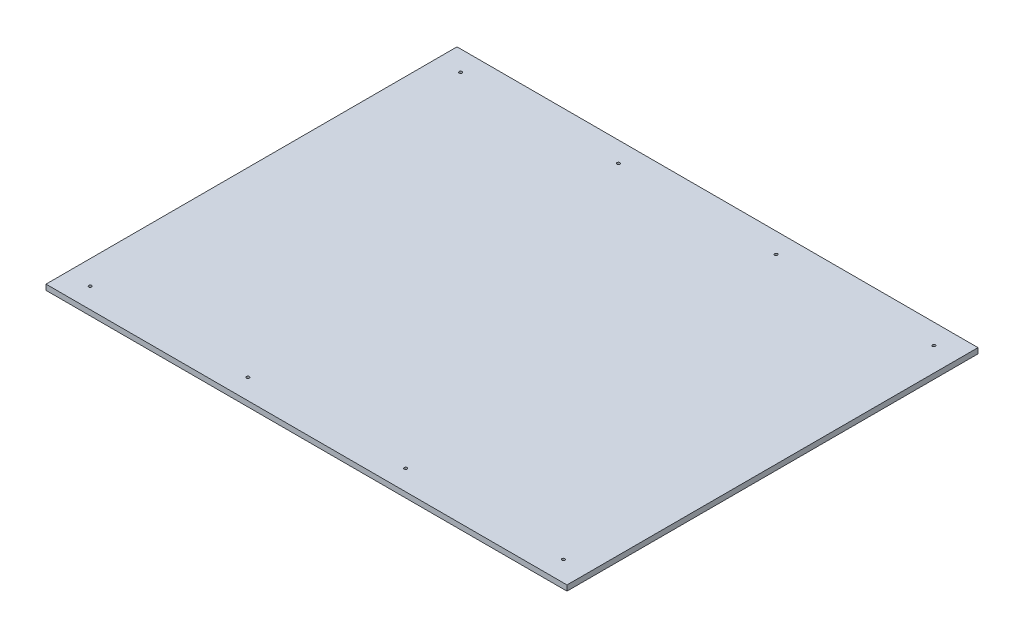
ISO-10303-21;
HEADER;
FILE_DESCRIPTION(('STEP AP214'),'2;1');
FILE_NAME('part.step','',(''),(''),'','','');
FILE_SCHEMA(('AUTOMOTIVE_DESIGN { 1 0 10303 214 1 1 1 1 }'));
ENDSEC;
DATA;
#1=APPLICATION_CONTEXT('core data for automotive mechanical design processes');
#2=APPLICATION_PROTOCOL_DEFINITION('international standard','automotive_design',2000,#1);
#3=PRODUCT_CONTEXT('',#1,'mechanical');
#4=PRODUCT('Part','Part','',(#3));
#5=PRODUCT_RELATED_PRODUCT_CATEGORY('part','',(#4));
#6=PRODUCT_DEFINITION_FORMATION('','',#4);
#7=PRODUCT_DEFINITION_CONTEXT('part definition',#1,'design');
#8=PRODUCT_DEFINITION('design','',#6,#7);
#9=PRODUCT_DEFINITION_SHAPE('','',#8);
#10=(LENGTH_UNIT() NAMED_UNIT(*) SI_UNIT(.MILLI.,.METRE.));
#11=(NAMED_UNIT(*) PLANE_ANGLE_UNIT() SI_UNIT($,.RADIAN.));
#12=(NAMED_UNIT(*) SI_UNIT($,.STERADIAN.) SOLID_ANGLE_UNIT());
#13=UNCERTAINTY_MEASURE_WITH_UNIT(LENGTH_MEASURE(1.E-05),#10,'distance_accuracy_value','');
#14=(GEOMETRIC_REPRESENTATION_CONTEXT(3) GLOBAL_UNCERTAINTY_ASSIGNED_CONTEXT((#13)) GLOBAL_UNIT_ASSIGNED_CONTEXT((#10,
#11,#12)) REPRESENTATION_CONTEXT('',''));
#15=CARTESIAN_POINT('',(0.,0.,0.));
#16=DIRECTION('',(0.,0.,1.));
#17=DIRECTION('',(1.,0.,0.));
#18=AXIS2_PLACEMENT_3D('',#15,#16,#17);
#19=CARTESIAN_POINT('',(571.5,11.90625,-450.85));
#20=DIRECTION('',(-1.,0.,0.));
#21=DIRECTION('',(0.,0.,1.));
#22=AXIS2_PLACEMENT_3D('',#19,#20,#21);
#23=PLANE('',#22);
#24=DIRECTION('',(0.,0.,-1.));
#25=VECTOR('',#24,1.);
#26=CARTESIAN_POINT('',(571.5,0.,-450.85));
#27=LINE('',#26,#25);
#28=CARTESIAN_POINT('',(571.5,0.,450.85));
#29=VERTEX_POINT('',#28);
#30=CARTESIAN_POINT('',(571.5,0.,-450.85));
#31=VERTEX_POINT('',#30);
#32=EDGE_CURVE('E98',#29,#31,#27,.T.);
#33=ORIENTED_EDGE('',*,*,#32,.T.);
#34=DIRECTION('',(0.,-1.,0.));
#35=VECTOR('',#34,1.);
#36=CARTESIAN_POINT('',(571.5,11.90625,-450.85));
#37=LINE('',#36,#35);
#38=CARTESIAN_POINT('',(571.5,11.90625,-450.85));
#39=VERTEX_POINT('',#38);
#40=EDGE_CURVE('E11',#39,#31,#37,.T.);
#41=ORIENTED_EDGE('',*,*,#40,.F.);
#42=DIRECTION('',(0.,0.,-1.));
#43=VECTOR('',#42,1.);
#44=CARTESIAN_POINT('',(571.5,11.90625,-450.85));
#45=LINE('',#44,#43);
#46=CARTESIAN_POINT('',(571.5,11.90625,450.85));
#47=VERTEX_POINT('',#46);
#48=EDGE_CURVE('E86',#47,#39,#45,.T.);
#49=ORIENTED_EDGE('',*,*,#48,.F.);
#50=DIRECTION('',(0.,-1.,0.));
#51=VECTOR('',#50,1.);
#52=CARTESIAN_POINT('',(571.5,11.90625,450.85));
#53=LINE('',#52,#51);
#54=EDGE_CURVE('E94',#47,#29,#53,.T.);
#55=ORIENTED_EDGE('',*,*,#54,.T.);
#56=EDGE_LOOP('',(#33,#41,#49,#55));
#57=FACE_BOUND('',#56,.T.);
#58=ADVANCED_FACE('F35',(#57),#23,.F.);
#59=CARTESIAN_POINT('',(-571.5,11.90625,-450.85));
#60=DIRECTION('',(0.,0.,1.));
#61=DIRECTION('',(1.,0.,0.));
#62=AXIS2_PLACEMENT_3D('',#59,#60,#61);
#63=PLANE('',#62);
#64=DIRECTION('',(-1.,0.,0.));
#65=VECTOR('',#64,1.);
#66=CARTESIAN_POINT('',(-571.5,0.,-450.85));
#67=LINE('',#66,#65);
#68=CARTESIAN_POINT('',(-571.5,0.,-450.85));
#69=VERTEX_POINT('',#68);
#70=EDGE_CURVE('E90',#31,#69,#67,.T.);
#71=ORIENTED_EDGE('',*,*,#70,.T.);
#72=DIRECTION('',(0.,-1.,0.));
#73=VECTOR('',#72,1.);
#74=CARTESIAN_POINT('',(-571.5,11.90625,-450.85));
#75=LINE('',#74,#73);
#76=CARTESIAN_POINT('',(-571.5,11.90625,-450.85));
#77=VERTEX_POINT('',#76);
#78=EDGE_CURVE('E43',#77,#69,#75,.T.);
#79=ORIENTED_EDGE('',*,*,#78,.F.);
#80=DIRECTION('',(-1.,0.,0.));
#81=VECTOR('',#80,1.);
#82=CARTESIAN_POINT('',(-571.5,11.90625,-450.85));
#83=LINE('',#82,#81);
#84=EDGE_CURVE('E81',#39,#77,#83,.T.);
#85=ORIENTED_EDGE('',*,*,#84,.F.);
#86=ORIENTED_EDGE('',*,*,#40,.T.);
#87=EDGE_LOOP('',(#71,#79,#85,#86));
#88=FACE_BOUND('',#87,.T.);
#89=ADVANCED_FACE('F89',(#88),#63,.F.);
#90=CARTESIAN_POINT('',(-571.5,11.90625,-450.85));
#91=DIRECTION('',(1.,0.,0.));
#92=DIRECTION('',(0.,0.,-1.));
#93=AXIS2_PLACEMENT_3D('',#90,#91,#92);
#94=PLANE('',#93);
#95=DIRECTION('',(0.,0.,1.));
#96=VECTOR('',#95,1.);
#97=CARTESIAN_POINT('',(-571.5,0.,-450.85));
#98=LINE('',#97,#96);
#99=CARTESIAN_POINT('',(-571.5,0.,450.85));
#100=VERTEX_POINT('',#99);
#101=EDGE_CURVE('E68',#69,#100,#98,.T.);
#102=ORIENTED_EDGE('',*,*,#101,.T.);
#103=DIRECTION('',(0.,-1.,0.));
#104=VECTOR('',#103,1.);
#105=CARTESIAN_POINT('',(-571.5,11.90625,450.85));
#106=LINE('',#105,#104);
#107=CARTESIAN_POINT('',(-571.5,11.90625,450.85));
#108=VERTEX_POINT('',#107);
#109=EDGE_CURVE('E91',#108,#100,#106,.T.);
#110=ORIENTED_EDGE('',*,*,#109,.F.);
#111=DIRECTION('',(0.,0.,1.));
#112=VECTOR('',#111,1.);
#113=CARTESIAN_POINT('',(-571.5,11.90625,-450.85));
#114=LINE('',#113,#112);
#115=EDGE_CURVE('E84',#77,#108,#114,.T.);
#116=ORIENTED_EDGE('',*,*,#115,.F.);
#117=ORIENTED_EDGE('',*,*,#78,.T.);
#118=EDGE_LOOP('',(#102,#110,#116,#117));
#119=FACE_BOUND('',#118,.T.);
#120=ADVANCED_FACE('F92',(#119),#94,.F.);
#121=CARTESIAN_POINT('',(-571.5,11.90625,450.85));
#122=DIRECTION('',(0.,0.,-1.));
#123=DIRECTION('',(-1.,0.,0.));
#124=AXIS2_PLACEMENT_3D('',#121,#122,#123);
#125=PLANE('',#124);
#126=DIRECTION('',(1.,0.,0.));
#127=VECTOR('',#126,1.);
#128=CARTESIAN_POINT('',(-571.5,0.,450.85));
#129=LINE('',#128,#127);
#130=EDGE_CURVE('E74',#100,#29,#129,.T.);
#131=ORIENTED_EDGE('',*,*,#130,.T.);
#132=ORIENTED_EDGE('',*,*,#54,.F.);
#133=DIRECTION('',(1.,0.,0.));
#134=VECTOR('',#133,1.);
#135=CARTESIAN_POINT('',(-571.5,11.90625,450.85));
#136=LINE('',#135,#134);
#137=EDGE_CURVE('E51',#108,#47,#136,.T.);
#138=ORIENTED_EDGE('',*,*,#137,.F.);
#139=ORIENTED_EDGE('',*,*,#109,.T.);
#140=EDGE_LOOP('',(#131,#132,#138,#139));
#141=FACE_BOUND('',#140,.T.);
#142=ADVANCED_FACE('F106',(#141),#125,.F.);
#143=CARTESIAN_POINT('',(0.,11.90625,0.));
#144=DIRECTION('',(0.,1.,0.));
#145=DIRECTION('',(0.,0.,1.));
#146=AXIS2_PLACEMENT_3D('',#143,#144,#145);
#147=PLANE('',#146);
#148=CARTESIAN_POINT('',(-519.1125,11.90625,406.4));
#149=DIRECTION('',(0.,-1.,0.));
#150=DIRECTION('',(0.,0.,-1.));
#151=AXIS2_PLACEMENT_3D('',#148,#149,#150);
#152=CIRCLE('',#151,3.17500000000004);
#153=CARTESIAN_POINT('',(-519.1125,11.90625,403.225));
#154=VERTEX_POINT('',#153);
#155=EDGE_CURVE('E153',#154,#154,#152,.T.);
#156=ORIENTED_EDGE('',*,*,#155,.T.);
#157=EDGE_LOOP('',(#156));
#158=FACE_BOUND('',#157,.T.);
#159=CARTESIAN_POINT('',(-173.0375,11.90625,406.400000000002));
#160=DIRECTION('',(0.,-1.,0.));
#161=DIRECTION('',(0.,0.,-1.));
#162=AXIS2_PLACEMENT_3D('',#159,#160,#161);
#163=CIRCLE('',#162,3.17499999999998);
#164=CARTESIAN_POINT('',(-173.0375,11.90625,403.225000000002));
#165=VERTEX_POINT('',#164);
#166=EDGE_CURVE('E147',#165,#165,#163,.T.);
#167=ORIENTED_EDGE('',*,*,#166,.T.);
#168=EDGE_LOOP('',(#167));
#169=FACE_BOUND('',#168,.T.);
#170=CARTESIAN_POINT('',(173.0375,11.90625,406.400000000005));
#171=DIRECTION('',(0.,-1.,0.));
#172=DIRECTION('',(0.,0.,-1.));
#173=AXIS2_PLACEMENT_3D('',#170,#171,#172);
#174=CIRCLE('',#173,3.17499999999998);
#175=CARTESIAN_POINT('',(173.0375,11.90625,403.225000000005));
#176=VERTEX_POINT('',#175);
#177=EDGE_CURVE('E141',#176,#176,#174,.T.);
#178=ORIENTED_EDGE('',*,*,#177,.T.);
#179=EDGE_LOOP('',(#178));
#180=FACE_BOUND('',#179,.T.);
#181=CARTESIAN_POINT('',(519.1125,11.90625,406.400000000007));
#182=DIRECTION('',(0.,-1.,0.));
#183=DIRECTION('',(0.,0.,-1.));
#184=AXIS2_PLACEMENT_3D('',#181,#182,#183);
#185=CIRCLE('',#184,3.17500000000004);
#186=CARTESIAN_POINT('',(519.1125,11.90625,403.225000000007));
#187=VERTEX_POINT('',#186);
#188=EDGE_CURVE('E135',#187,#187,#185,.T.);
#189=ORIENTED_EDGE('',*,*,#188,.T.);
#190=EDGE_LOOP('',(#189));
#191=FACE_BOUND('',#190,.T.);
#192=CARTESIAN_POINT('',(-173.0375,11.90625,-406.399999999998));
#193=DIRECTION('',(0.,-1.,0.));
#194=DIRECTION('',(0.,0.,-1.));
#195=AXIS2_PLACEMENT_3D('',#192,#193,#194);
#196=CIRCLE('',#195,3.17499999999998);
#197=CARTESIAN_POINT('',(-173.0375,11.90625,-409.574999999998));
#198=VERTEX_POINT('',#197);
#199=EDGE_CURVE('E129',#198,#198,#196,.T.);
#200=ORIENTED_EDGE('',*,*,#199,.T.);
#201=EDGE_LOOP('',(#200));
#202=FACE_BOUND('',#201,.T.);
#203=CARTESIAN_POINT('',(173.0375,11.90625,-406.399999999995));
#204=DIRECTION('',(0.,-1.,0.));
#205=DIRECTION('',(0.,0.,-1.));
#206=AXIS2_PLACEMENT_3D('',#203,#204,#205);
#207=CIRCLE('',#206,3.17499999999998);
#208=CARTESIAN_POINT('',(173.0375,11.90625,-409.574999999995));
#209=VERTEX_POINT('',#208);
#210=EDGE_CURVE('E123',#209,#209,#207,.T.);
#211=ORIENTED_EDGE('',*,*,#210,.T.);
#212=EDGE_LOOP('',(#211));
#213=FACE_BOUND('',#212,.T.);
#214=CARTESIAN_POINT('',(519.1125,11.90625,-406.399999999993));
#215=DIRECTION('',(0.,-1.,0.));
#216=DIRECTION('',(0.,0.,-1.));
#217=AXIS2_PLACEMENT_3D('',#214,#215,#216);
#218=CIRCLE('',#217,3.17500000000004);
#219=CARTESIAN_POINT('',(519.1125,11.90625,-409.574999999993));
#220=VERTEX_POINT('',#219);
#221=EDGE_CURVE('E117',#220,#220,#218,.T.);
#222=ORIENTED_EDGE('',*,*,#221,.T.);
#223=EDGE_LOOP('',(#222));
#224=FACE_BOUND('',#223,.T.);
#225=CARTESIAN_POINT('',(-519.1125,11.90625,-406.4));
#226=DIRECTION('',(0.,-1.,0.));
#227=DIRECTION('',(0.,0.,-1.));
#228=AXIS2_PLACEMENT_3D('',#225,#226,#227);
#229=CIRCLE('',#228,3.17500000000004);
#230=CARTESIAN_POINT('',(-519.1125,11.90625,-409.575));
#231=VERTEX_POINT('',#230);
#232=EDGE_CURVE('E101',#231,#231,#229,.T.);
#233=ORIENTED_EDGE('',*,*,#232,.T.);
#234=EDGE_LOOP('',(#233));
#235=FACE_BOUND('',#234,.T.);
#236=ORIENTED_EDGE('',*,*,#48,.T.);
#237=ORIENTED_EDGE('',*,*,#84,.T.);
#238=ORIENTED_EDGE('',*,*,#115,.T.);
#239=ORIENTED_EDGE('',*,*,#137,.T.);
#240=EDGE_LOOP('',(#236,#237,#238,#239));
#241=FACE_BOUND('',#240,.T.);
#242=ADVANCED_FACE('F82',(#158,#169,#180,#191,#202,#213,#224,#235,#241),#147,.T.);
#243=CARTESIAN_POINT('',(0.,0.,0.));
#244=DIRECTION('',(0.,1.,0.));
#245=DIRECTION('',(0.,0.,1.));
#246=AXIS2_PLACEMENT_3D('',#243,#244,#245);
#247=PLANE('',#246);
#248=CARTESIAN_POINT('',(-519.1125,0.,406.4));
#249=DIRECTION('',(0.,-1.,0.));
#250=DIRECTION('',(0.,0.,-1.));
#251=AXIS2_PLACEMENT_3D('',#248,#249,#250);
#252=CIRCLE('',#251,3.17500000000004);
#253=CARTESIAN_POINT('',(-519.1125,0.,403.225));
#254=VERTEX_POINT('',#253);
#255=EDGE_CURVE('E156',#254,#254,#252,.T.);
#256=ORIENTED_EDGE('',*,*,#255,.F.);
#257=EDGE_LOOP('',(#256));
#258=FACE_BOUND('',#257,.T.);
#259=CARTESIAN_POINT('',(-173.0375,0.,406.400000000002));
#260=DIRECTION('',(0.,-1.,0.));
#261=DIRECTION('',(0.,0.,-1.));
#262=AXIS2_PLACEMENT_3D('',#259,#260,#261);
#263=CIRCLE('',#262,3.17499999999998);
#264=CARTESIAN_POINT('',(-173.0375,0.,403.225000000002));
#265=VERTEX_POINT('',#264);
#266=EDGE_CURVE('E150',#265,#265,#263,.T.);
#267=ORIENTED_EDGE('',*,*,#266,.F.);
#268=EDGE_LOOP('',(#267));
#269=FACE_BOUND('',#268,.T.);
#270=CARTESIAN_POINT('',(173.0375,0.,406.400000000005));
#271=DIRECTION('',(0.,-1.,0.));
#272=DIRECTION('',(0.,0.,-1.));
#273=AXIS2_PLACEMENT_3D('',#270,#271,#272);
#274=CIRCLE('',#273,3.17499999999998);
#275=CARTESIAN_POINT('',(173.0375,0.,403.225000000005));
#276=VERTEX_POINT('',#275);
#277=EDGE_CURVE('E144',#276,#276,#274,.T.);
#278=ORIENTED_EDGE('',*,*,#277,.F.);
#279=EDGE_LOOP('',(#278));
#280=FACE_BOUND('',#279,.T.);
#281=CARTESIAN_POINT('',(519.1125,0.,406.400000000007));
#282=DIRECTION('',(0.,-1.,0.));
#283=DIRECTION('',(0.,0.,-1.));
#284=AXIS2_PLACEMENT_3D('',#281,#282,#283);
#285=CIRCLE('',#284,3.17500000000004);
#286=CARTESIAN_POINT('',(519.1125,0.,403.225000000007));
#287=VERTEX_POINT('',#286);
#288=EDGE_CURVE('E138',#287,#287,#285,.T.);
#289=ORIENTED_EDGE('',*,*,#288,.F.);
#290=EDGE_LOOP('',(#289));
#291=FACE_BOUND('',#290,.T.);
#292=CARTESIAN_POINT('',(-173.0375,0.,-406.399999999998));
#293=DIRECTION('',(0.,-1.,0.));
#294=DIRECTION('',(0.,0.,-1.));
#295=AXIS2_PLACEMENT_3D('',#292,#293,#294);
#296=CIRCLE('',#295,3.17499999999998);
#297=CARTESIAN_POINT('',(-173.0375,0.,-409.574999999998));
#298=VERTEX_POINT('',#297);
#299=EDGE_CURVE('E132',#298,#298,#296,.T.);
#300=ORIENTED_EDGE('',*,*,#299,.F.);
#301=EDGE_LOOP('',(#300));
#302=FACE_BOUND('',#301,.T.);
#303=CARTESIAN_POINT('',(173.0375,0.,-406.399999999995));
#304=DIRECTION('',(0.,-1.,0.));
#305=DIRECTION('',(0.,0.,-1.));
#306=AXIS2_PLACEMENT_3D('',#303,#304,#305);
#307=CIRCLE('',#306,3.17499999999998);
#308=CARTESIAN_POINT('',(173.0375,0.,-409.574999999995));
#309=VERTEX_POINT('',#308);
#310=EDGE_CURVE('E126',#309,#309,#307,.T.);
#311=ORIENTED_EDGE('',*,*,#310,.F.);
#312=EDGE_LOOP('',(#311));
#313=FACE_BOUND('',#312,.T.);
#314=CARTESIAN_POINT('',(519.1125,0.,-406.399999999993));
#315=DIRECTION('',(0.,-1.,0.));
#316=DIRECTION('',(0.,0.,-1.));
#317=AXIS2_PLACEMENT_3D('',#314,#315,#316);
#318=CIRCLE('',#317,3.17500000000004);
#319=CARTESIAN_POINT('',(519.1125,0.,-409.574999999993));
#320=VERTEX_POINT('',#319);
#321=EDGE_CURVE('E120',#320,#320,#318,.T.);
#322=ORIENTED_EDGE('',*,*,#321,.F.);
#323=EDGE_LOOP('',(#322));
#324=FACE_BOUND('',#323,.T.);
#325=CARTESIAN_POINT('',(-519.1125,0.,-406.4));
#326=DIRECTION('',(0.,-1.,0.));
#327=DIRECTION('',(0.,0.,-1.));
#328=AXIS2_PLACEMENT_3D('',#325,#326,#327);
#329=CIRCLE('',#328,3.17500000000004);
#330=CARTESIAN_POINT('',(-519.1125,0.,-409.575));
#331=VERTEX_POINT('',#330);
#332=EDGE_CURVE('E114',#331,#331,#329,.T.);
#333=ORIENTED_EDGE('',*,*,#332,.F.);
#334=EDGE_LOOP('',(#333));
#335=FACE_BOUND('',#334,.T.);
#336=ORIENTED_EDGE('',*,*,#32,.F.);
#337=ORIENTED_EDGE('',*,*,#130,.F.);
#338=ORIENTED_EDGE('',*,*,#101,.F.);
#339=ORIENTED_EDGE('',*,*,#70,.F.);
#340=EDGE_LOOP('',(#336,#337,#338,#339));
#341=FACE_BOUND('',#340,.T.);
#342=ADVANCED_FACE('F109',(#258,#269,#280,#291,#302,#313,#324,#335,#341),#247,.F.);
#343=CARTESIAN_POINT('',(-519.1125,0.,-406.4));
#344=DIRECTION('',(0.,-1.,0.));
#345=DIRECTION('',(0.,0.,-1.));
#346=AXIS2_PLACEMENT_3D('',#343,#344,#345);
#347=CYLINDRICAL_SURFACE('',#346,3.17500000000004);
#348=ORIENTED_EDGE('',*,*,#232,.F.);
#349=EDGE_LOOP('',(#348));
#350=FACE_BOUND('',#349,.T.);
#351=ORIENTED_EDGE('',*,*,#332,.T.);
#352=EDGE_LOOP('',(#351));
#353=FACE_BOUND('',#352,.T.);
#354=ADVANCED_FACE('F164',(#350,#353),#347,.F.);
#355=CARTESIAN_POINT('',(519.1125,0.,-406.399999999993));
#356=DIRECTION('',(0.,-1.,0.));
#357=DIRECTION('',(0.,0.,-1.));
#358=AXIS2_PLACEMENT_3D('',#355,#356,#357);
#359=CYLINDRICAL_SURFACE('',#358,3.17500000000004);
#360=ORIENTED_EDGE('',*,*,#221,.F.);
#361=EDGE_LOOP('',(#360));
#362=FACE_BOUND('',#361,.T.);
#363=ORIENTED_EDGE('',*,*,#321,.T.);
#364=EDGE_LOOP('',(#363));
#365=FACE_BOUND('',#364,.T.);
#366=ADVANCED_FACE('F181',(#362,#365),#359,.F.);
#367=CARTESIAN_POINT('',(173.0375,0.,-406.399999999995));
#368=DIRECTION('',(0.,-1.,0.));
#369=DIRECTION('',(0.,0.,-1.));
#370=AXIS2_PLACEMENT_3D('',#367,#368,#369);
#371=CYLINDRICAL_SURFACE('',#370,3.17499999999998);
#372=ORIENTED_EDGE('',*,*,#210,.F.);
#373=EDGE_LOOP('',(#372));
#374=FACE_BOUND('',#373,.T.);
#375=ORIENTED_EDGE('',*,*,#310,.T.);
#376=EDGE_LOOP('',(#375));
#377=FACE_BOUND('',#376,.T.);
#378=ADVANCED_FACE('F187',(#374,#377),#371,.F.);
#379=CARTESIAN_POINT('',(-173.0375,0.,-406.399999999998));
#380=DIRECTION('',(0.,-1.,0.));
#381=DIRECTION('',(0.,0.,-1.));
#382=AXIS2_PLACEMENT_3D('',#379,#380,#381);
#383=CYLINDRICAL_SURFACE('',#382,3.17499999999998);
#384=ORIENTED_EDGE('',*,*,#199,.F.);
#385=EDGE_LOOP('',(#384));
#386=FACE_BOUND('',#385,.T.);
#387=ORIENTED_EDGE('',*,*,#299,.T.);
#388=EDGE_LOOP('',(#387));
#389=FACE_BOUND('',#388,.T.);
#390=ADVANCED_FACE('F224',(#386,#389),#383,.F.);
#391=CARTESIAN_POINT('',(519.1125,0.,406.400000000007));
#392=DIRECTION('',(0.,-1.,0.));
#393=DIRECTION('',(0.,0.,-1.));
#394=AXIS2_PLACEMENT_3D('',#391,#392,#393);
#395=CYLINDRICAL_SURFACE('',#394,3.17500000000004);
#396=ORIENTED_EDGE('',*,*,#188,.F.);
#397=EDGE_LOOP('',(#396));
#398=FACE_BOUND('',#397,.T.);
#399=ORIENTED_EDGE('',*,*,#288,.T.);
#400=EDGE_LOOP('',(#399));
#401=FACE_BOUND('',#400,.T.);
#402=ADVANCED_FACE('F229',(#398,#401),#395,.F.);
#403=CARTESIAN_POINT('',(173.0375,0.,406.400000000005));
#404=DIRECTION('',(0.,-1.,0.));
#405=DIRECTION('',(0.,0.,-1.));
#406=AXIS2_PLACEMENT_3D('',#403,#404,#405);
#407=CYLINDRICAL_SURFACE('',#406,3.17499999999998);
#408=ORIENTED_EDGE('',*,*,#177,.F.);
#409=EDGE_LOOP('',(#408));
#410=FACE_BOUND('',#409,.T.);
#411=ORIENTED_EDGE('',*,*,#277,.T.);
#412=EDGE_LOOP('',(#411));
#413=FACE_BOUND('',#412,.T.);
#414=ADVANCED_FACE('F235',(#410,#413),#407,.F.);
#415=CARTESIAN_POINT('',(-173.0375,0.,406.400000000002));
#416=DIRECTION('',(0.,-1.,0.));
#417=DIRECTION('',(0.,0.,-1.));
#418=AXIS2_PLACEMENT_3D('',#415,#416,#417);
#419=CYLINDRICAL_SURFACE('',#418,3.17499999999998);
#420=ORIENTED_EDGE('',*,*,#166,.F.);
#421=EDGE_LOOP('',(#420));
#422=FACE_BOUND('',#421,.T.);
#423=ORIENTED_EDGE('',*,*,#266,.T.);
#424=EDGE_LOOP('',(#423));
#425=FACE_BOUND('',#424,.T.);
#426=ADVANCED_FACE('F239',(#422,#425),#419,.F.);
#427=CARTESIAN_POINT('',(-519.1125,0.,406.4));
#428=DIRECTION('',(0.,-1.,0.));
#429=DIRECTION('',(0.,0.,-1.));
#430=AXIS2_PLACEMENT_3D('',#427,#428,#429);
#431=CYLINDRICAL_SURFACE('',#430,3.17500000000004);
#432=ORIENTED_EDGE('',*,*,#155,.F.);
#433=EDGE_LOOP('',(#432));
#434=FACE_BOUND('',#433,.T.);
#435=ORIENTED_EDGE('',*,*,#255,.T.);
#436=EDGE_LOOP('',(#435));
#437=FACE_BOUND('',#436,.T.);
#438=ADVANCED_FACE('F160',(#434,#437),#431,.F.);
#439=CLOSED_SHELL('',(#58,#89,#120,#142,#242,#342,#354,#366,#378,#390,#402,#414,#426,#438));
#440=MANIFOLD_SOLID_BREP('B2',#439);
#441=ADVANCED_BREP_SHAPE_REPRESENTATION('',(#18,#440),#14);
#442=SHAPE_DEFINITION_REPRESENTATION(#9,#441);
ENDSEC;
END-ISO-10303-21;
